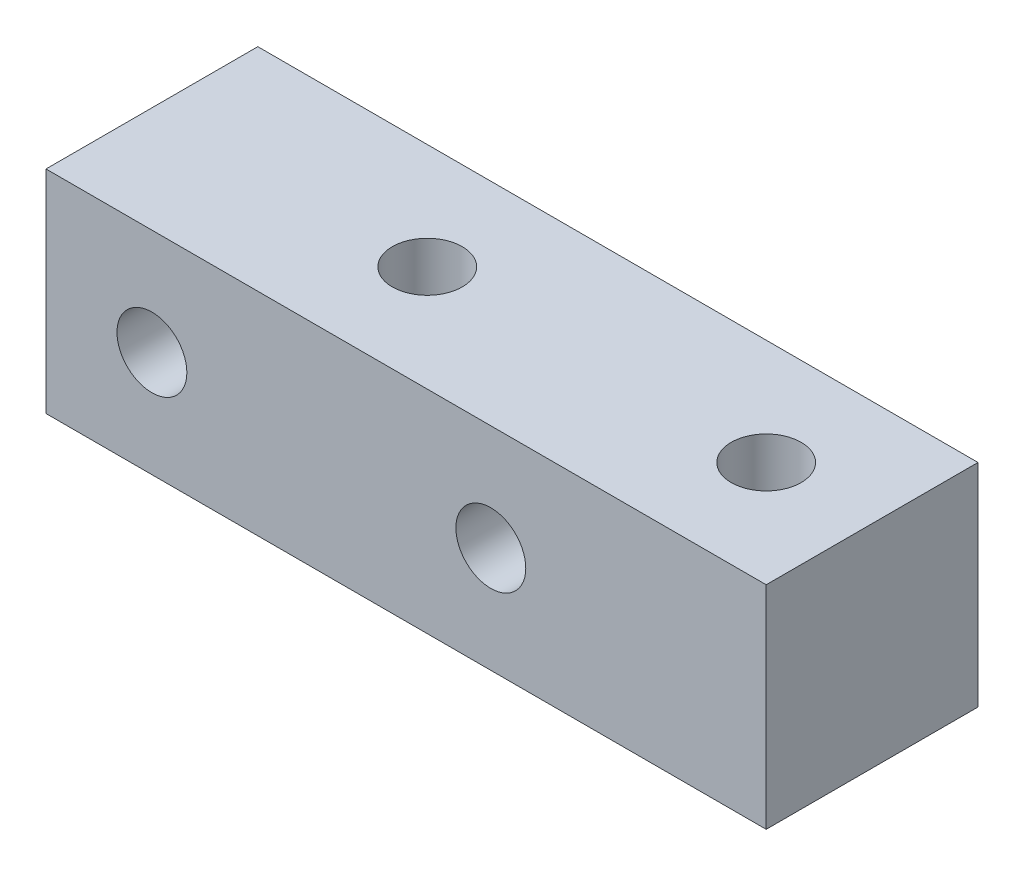
ISO-10303-21;
HEADER;
FILE_DESCRIPTION(('STEP AP214'),'2;1');
FILE_NAME('part.step','',(''),(''),'','','');
FILE_SCHEMA(('AUTOMOTIVE_DESIGN { 1 0 10303 214 1 1 1 1 }'));
ENDSEC;
DATA;
#1=APPLICATION_CONTEXT('core data for automotive mechanical design processes');
#2=APPLICATION_PROTOCOL_DEFINITION('international standard','automotive_design',2000,#1);
#3=PRODUCT_CONTEXT('',#1,'mechanical');
#4=PRODUCT('Part','Part','',(#3));
#5=PRODUCT_RELATED_PRODUCT_CATEGORY('part','',(#4));
#6=PRODUCT_DEFINITION_FORMATION('','',#4);
#7=PRODUCT_DEFINITION_CONTEXT('part definition',#1,'design');
#8=PRODUCT_DEFINITION('design','',#6,#7);
#9=PRODUCT_DEFINITION_SHAPE('','',#8);
#10=(LENGTH_UNIT() NAMED_UNIT(*) SI_UNIT(.MILLI.,.METRE.));
#11=(NAMED_UNIT(*) PLANE_ANGLE_UNIT() SI_UNIT($,.RADIAN.));
#12=(NAMED_UNIT(*) SI_UNIT($,.STERADIAN.) SOLID_ANGLE_UNIT());
#13=UNCERTAINTY_MEASURE_WITH_UNIT(LENGTH_MEASURE(1.E-05),#10,'distance_accuracy_value','');
#14=(GEOMETRIC_REPRESENTATION_CONTEXT(3) GLOBAL_UNCERTAINTY_ASSIGNED_CONTEXT((#13)) GLOBAL_UNIT_ASSIGNED_CONTEXT((#10,
#11,#12)) REPRESENTATION_CONTEXT('',''));
#15=CARTESIAN_POINT('',(0.,0.,0.));
#16=DIRECTION('',(0.,0.,1.));
#17=DIRECTION('',(1.,0.,0.));
#18=AXIS2_PLACEMENT_3D('',#15,#16,#17);
#19=CARTESIAN_POINT('',(-17.,-5.,10.));
#20=DIRECTION('',(1.,0.,0.));
#21=DIRECTION('',(0.,0.,-1.));
#22=AXIS2_PLACEMENT_3D('',#19,#20,#21);
#23=PLANE('',#22);
#24=DIRECTION('',(0.,-1.,0.));
#25=VECTOR('',#24,1.);
#26=CARTESIAN_POINT('',(-17.,-5.,0.));
#27=LINE('',#26,#25);
#28=CARTESIAN_POINT('',(-17.,5.,0.));
#29=VERTEX_POINT('',#28);
#30=CARTESIAN_POINT('',(-17.,-5.,0.));
#31=VERTEX_POINT('',#30);
#32=EDGE_CURVE('E107',#29,#31,#27,.T.);
#33=ORIENTED_EDGE('',*,*,#32,.T.);
#34=DIRECTION('',(0.,0.,-1.));
#35=VECTOR('',#34,1.);
#36=CARTESIAN_POINT('',(-17.,-5.,10.));
#37=LINE('',#36,#35);
#38=CARTESIAN_POINT('',(-17.,-5.,10.));
#39=VERTEX_POINT('',#38);
#40=EDGE_CURVE('E11',#39,#31,#37,.T.);
#41=ORIENTED_EDGE('',*,*,#40,.F.);
#42=DIRECTION('',(0.,-1.,0.));
#43=VECTOR('',#42,1.);
#44=CARTESIAN_POINT('',(-17.,-5.,10.));
#45=LINE('',#44,#43);
#46=CARTESIAN_POINT('',(-17.,5.,10.));
#47=VERTEX_POINT('',#46);
#48=EDGE_CURVE('E91',#47,#39,#45,.T.);
#49=ORIENTED_EDGE('',*,*,#48,.F.);
#50=DIRECTION('',(0.,0.,-1.));
#51=VECTOR('',#50,1.);
#52=CARTESIAN_POINT('',(-17.,5.,10.));
#53=LINE('',#52,#51);
#54=EDGE_CURVE('E103',#47,#29,#53,.T.);
#55=ORIENTED_EDGE('',*,*,#54,.T.);
#56=EDGE_LOOP('',(#33,#41,#49,#55));
#57=FACE_BOUND('',#56,.T.);
#58=ADVANCED_FACE('F39',(#57),#23,.F.);
#59=CARTESIAN_POINT('',(17.,-5.,10.));
#60=DIRECTION('',(0.,1.,0.));
#61=DIRECTION('',(-1.,0.,0.));
#62=AXIS2_PLACEMENT_3D('',#59,#60,#61);
#63=PLANE('',#62);
#64=CARTESIAN_POINT('',(-4.,-5.00000000000001,5.));
#65=DIRECTION('',(0.,1.,0.));
#66=DIRECTION('',(0.,0.,1.));
#67=AXIS2_PLACEMENT_3D('',#64,#65,#66);
#68=CIRCLE('',#67,1.65);
#69=CARTESIAN_POINT('',(-4.,-5.00000000000001,6.65));
#70=VERTEX_POINT('',#69);
#71=EDGE_CURVE('E151',#70,#70,#68,.T.);
#72=ORIENTED_EDGE('',*,*,#71,.T.);
#73=EDGE_LOOP('',(#72));
#74=FACE_BOUND('',#73,.T.);
#75=CARTESIAN_POINT('',(12.,-5.00000000000001,5.));
#76=DIRECTION('',(0.,1.,0.));
#77=DIRECTION('',(0.,0.,1.));
#78=AXIS2_PLACEMENT_3D('',#75,#76,#77);
#79=CIRCLE('',#78,1.65);
#80=CARTESIAN_POINT('',(12.,-5.00000000000001,6.65));
#81=VERTEX_POINT('',#80);
#82=EDGE_CURVE('E143',#81,#81,#79,.T.);
#83=ORIENTED_EDGE('',*,*,#82,.T.);
#84=EDGE_LOOP('',(#83));
#85=FACE_BOUND('',#84,.T.);
#86=DIRECTION('',(1.,0.,0.));
#87=VECTOR('',#86,1.);
#88=CARTESIAN_POINT('',(17.,-5.,0.));
#89=LINE('',#88,#87);
#90=CARTESIAN_POINT('',(17.,-5.,0.));
#91=VERTEX_POINT('',#90);
#92=EDGE_CURVE('E96',#31,#91,#89,.T.);
#93=ORIENTED_EDGE('',*,*,#92,.T.);
#94=DIRECTION('',(0.,0.,-1.));
#95=VECTOR('',#94,1.);
#96=CARTESIAN_POINT('',(17.,-5.,10.));
#97=LINE('',#96,#95);
#98=CARTESIAN_POINT('',(17.,-5.,10.));
#99=VERTEX_POINT('',#98);
#100=EDGE_CURVE('E48',#99,#91,#97,.T.);
#101=ORIENTED_EDGE('',*,*,#100,.F.);
#102=DIRECTION('',(1.,0.,0.));
#103=VECTOR('',#102,1.);
#104=CARTESIAN_POINT('',(17.,-5.,10.));
#105=LINE('',#104,#103);
#106=EDGE_CURVE('E86',#39,#99,#105,.T.);
#107=ORIENTED_EDGE('',*,*,#106,.F.);
#108=ORIENTED_EDGE('',*,*,#40,.T.);
#109=EDGE_LOOP('',(#93,#101,#107,#108));
#110=FACE_BOUND('',#109,.T.);
#111=ADVANCED_FACE('F95',(#74,#85,#110),#63,.F.);
#112=CARTESIAN_POINT('',(17.,-5.,10.));
#113=DIRECTION('',(-1.,0.,0.));
#114=DIRECTION('',(0.,0.,1.));
#115=AXIS2_PLACEMENT_3D('',#112,#113,#114);
#116=PLANE('',#115);
#117=DIRECTION('',(0.,1.,0.));
#118=VECTOR('',#117,1.);
#119=CARTESIAN_POINT('',(17.,-5.,0.));
#120=LINE('',#119,#118);
#121=CARTESIAN_POINT('',(17.,5.,0.));
#122=VERTEX_POINT('',#121);
#123=EDGE_CURVE('E73',#91,#122,#120,.T.);
#124=ORIENTED_EDGE('',*,*,#123,.T.);
#125=DIRECTION('',(0.,0.,-1.));
#126=VECTOR('',#125,1.);
#127=CARTESIAN_POINT('',(17.,5.,10.));
#128=LINE('',#127,#126);
#129=CARTESIAN_POINT('',(17.,5.,10.));
#130=VERTEX_POINT('',#129);
#131=EDGE_CURVE('E98',#130,#122,#128,.T.);
#132=ORIENTED_EDGE('',*,*,#131,.F.);
#133=DIRECTION('',(0.,1.,0.));
#134=VECTOR('',#133,1.);
#135=CARTESIAN_POINT('',(17.,-5.,10.));
#136=LINE('',#135,#134);
#137=EDGE_CURVE('E89',#99,#130,#136,.T.);
#138=ORIENTED_EDGE('',*,*,#137,.F.);
#139=ORIENTED_EDGE('',*,*,#100,.T.);
#140=EDGE_LOOP('',(#124,#132,#138,#139));
#141=FACE_BOUND('',#140,.T.);
#142=ADVANCED_FACE('F99',(#141),#116,.F.);
#143=CARTESIAN_POINT('',(17.,5.,10.));
#144=DIRECTION('',(0.,-1.,0.));
#145=DIRECTION('',(1.,0.,0.));
#146=AXIS2_PLACEMENT_3D('',#143,#144,#145);
#147=PLANE('',#146);
#148=CARTESIAN_POINT('',(-4.,5.,5.));
#149=DIRECTION('',(0.,1.,0.));
#150=DIRECTION('',(0.,0.,1.));
#151=AXIS2_PLACEMENT_3D('',#148,#149,#150);
#152=CIRCLE('',#151,1.65);
#153=CARTESIAN_POINT('',(-4.,5.,6.65));
#154=VERTEX_POINT('',#153);
#155=EDGE_CURVE('E155',#154,#154,#152,.T.);
#156=ORIENTED_EDGE('',*,*,#155,.F.);
#157=EDGE_LOOP('',(#156));
#158=FACE_BOUND('',#157,.T.);
#159=CARTESIAN_POINT('',(12.,5.,5.));
#160=DIRECTION('',(0.,1.,0.));
#161=DIRECTION('',(0.,0.,1.));
#162=AXIS2_PLACEMENT_3D('',#159,#160,#161);
#163=CIRCLE('',#162,1.65);
#164=CARTESIAN_POINT('',(12.,5.,6.65));
#165=VERTEX_POINT('',#164);
#166=EDGE_CURVE('E147',#165,#165,#163,.T.);
#167=ORIENTED_EDGE('',*,*,#166,.F.);
#168=EDGE_LOOP('',(#167));
#169=FACE_BOUND('',#168,.T.);
#170=DIRECTION('',(-1.,0.,0.));
#171=VECTOR('',#170,1.);
#172=CARTESIAN_POINT('',(17.,5.,0.));
#173=LINE('',#172,#171);
#174=EDGE_CURVE('E79',#122,#29,#173,.T.);
#175=ORIENTED_EDGE('',*,*,#174,.T.);
#176=ORIENTED_EDGE('',*,*,#54,.F.);
#177=DIRECTION('',(-1.,0.,0.));
#178=VECTOR('',#177,1.);
#179=CARTESIAN_POINT('',(17.,5.,10.));
#180=LINE('',#179,#178);
#181=EDGE_CURVE('E56',#130,#47,#180,.T.);
#182=ORIENTED_EDGE('',*,*,#181,.F.);
#183=ORIENTED_EDGE('',*,*,#131,.T.);
#184=EDGE_LOOP('',(#175,#176,#182,#183));
#185=FACE_BOUND('',#184,.T.);
#186=ADVANCED_FACE('F121',(#158,#169,#185),#147,.F.);
#187=CARTESIAN_POINT('',(0.,0.,10.));
#188=DIRECTION('',(0.,0.,1.));
#189=DIRECTION('',(1.,0.,0.));
#190=AXIS2_PLACEMENT_3D('',#187,#188,#189);
#191=PLANE('',#190);
#192=CARTESIAN_POINT('',(4.,0.,10.));
#193=DIRECTION('',(0.,0.,1.));
#194=DIRECTION('',(1.,0.,0.));
#195=AXIS2_PLACEMENT_3D('',#192,#193,#194);
#196=CIRCLE('',#195,1.65);
#197=CARTESIAN_POINT('',(5.65,0.,10.));
#198=VERTEX_POINT('',#197);
#199=EDGE_CURVE('E139',#198,#198,#196,.T.);
#200=ORIENTED_EDGE('',*,*,#199,.F.);
#201=EDGE_LOOP('',(#200));
#202=FACE_BOUND('',#201,.T.);
#203=CARTESIAN_POINT('',(-12.,0.,10.));
#204=DIRECTION('',(0.,0.,1.));
#205=DIRECTION('',(1.,0.,0.));
#206=AXIS2_PLACEMENT_3D('',#203,#204,#205);
#207=CIRCLE('',#206,1.65);
#208=CARTESIAN_POINT('',(-10.35,0.,10.));
#209=VERTEX_POINT('',#208);
#210=EDGE_CURVE('E131',#209,#209,#207,.T.);
#211=ORIENTED_EDGE('',*,*,#210,.F.);
#212=EDGE_LOOP('',(#211));
#213=FACE_BOUND('',#212,.T.);
#214=ORIENTED_EDGE('',*,*,#48,.T.);
#215=ORIENTED_EDGE('',*,*,#106,.T.);
#216=ORIENTED_EDGE('',*,*,#137,.T.);
#217=ORIENTED_EDGE('',*,*,#181,.T.);
#218=EDGE_LOOP('',(#214,#215,#216,#217));
#219=FACE_BOUND('',#218,.T.);
#220=ADVANCED_FACE('F87',(#202,#213,#219),#191,.T.);
#221=CARTESIAN_POINT('',(0.,0.,0.));
#222=DIRECTION('',(0.,0.,1.));
#223=DIRECTION('',(1.,0.,0.));
#224=AXIS2_PLACEMENT_3D('',#221,#222,#223);
#225=PLANE('',#224);
#226=CARTESIAN_POINT('',(4.,0.,0.));
#227=DIRECTION('',(0.,0.,1.));
#228=DIRECTION('',(1.,0.,0.));
#229=AXIS2_PLACEMENT_3D('',#226,#227,#228);
#230=CIRCLE('',#229,1.65);
#231=CARTESIAN_POINT('',(5.65,0.,0.));
#232=VERTEX_POINT('',#231);
#233=EDGE_CURVE('E135',#232,#232,#230,.T.);
#234=ORIENTED_EDGE('',*,*,#233,.T.);
#235=EDGE_LOOP('',(#234));
#236=FACE_BOUND('',#235,.T.);
#237=CARTESIAN_POINT('',(-12.,0.,0.));
#238=DIRECTION('',(0.,0.,1.));
#239=DIRECTION('',(1.,0.,0.));
#240=AXIS2_PLACEMENT_3D('',#237,#238,#239);
#241=CIRCLE('',#240,1.65);
#242=CARTESIAN_POINT('',(-10.35,0.,0.));
#243=VERTEX_POINT('',#242);
#244=EDGE_CURVE('E111',#243,#243,#241,.T.);
#245=ORIENTED_EDGE('',*,*,#244,.T.);
#246=EDGE_LOOP('',(#245));
#247=FACE_BOUND('',#246,.T.);
#248=ORIENTED_EDGE('',*,*,#32,.F.);
#249=ORIENTED_EDGE('',*,*,#174,.F.);
#250=ORIENTED_EDGE('',*,*,#123,.F.);
#251=ORIENTED_EDGE('',*,*,#92,.F.);
#252=EDGE_LOOP('',(#248,#249,#250,#251));
#253=FACE_BOUND('',#252,.T.);
#254=ADVANCED_FACE('F124',(#236,#247,#253),#225,.F.);
#255=CARTESIAN_POINT('',(-12.,0.,10.));
#256=DIRECTION('',(0.,0.,1.));
#257=DIRECTION('',(1.,0.,0.));
#258=AXIS2_PLACEMENT_3D('',#255,#256,#257);
#259=CYLINDRICAL_SURFACE('',#258,1.65);
#260=ORIENTED_EDGE('',*,*,#244,.F.);
#261=EDGE_LOOP('',(#260));
#262=FACE_BOUND('',#261,.T.);
#263=ORIENTED_EDGE('',*,*,#210,.T.);
#264=EDGE_LOOP('',(#263));
#265=FACE_BOUND('',#264,.T.);
#266=ADVANCED_FACE('F178',(#262,#265),#259,.F.);
#267=CARTESIAN_POINT('',(4.,0.,10.));
#268=DIRECTION('',(0.,0.,1.));
#269=DIRECTION('',(1.,0.,0.));
#270=AXIS2_PLACEMENT_3D('',#267,#268,#269);
#271=CYLINDRICAL_SURFACE('',#270,1.65);
#272=ORIENTED_EDGE('',*,*,#233,.F.);
#273=EDGE_LOOP('',(#272));
#274=FACE_BOUND('',#273,.T.);
#275=ORIENTED_EDGE('',*,*,#199,.T.);
#276=EDGE_LOOP('',(#275));
#277=FACE_BOUND('',#276,.T.);
#278=ADVANCED_FACE('F169',(#274,#277),#271,.F.);
#279=CARTESIAN_POINT('',(12.,5.,5.));
#280=DIRECTION('',(0.,1.,0.));
#281=DIRECTION('',(0.,0.,1.));
#282=AXIS2_PLACEMENT_3D('',#279,#280,#281);
#283=CYLINDRICAL_SURFACE('',#282,1.65);
#284=ORIENTED_EDGE('',*,*,#82,.F.);
#285=EDGE_LOOP('',(#284));
#286=FACE_BOUND('',#285,.T.);
#287=ORIENTED_EDGE('',*,*,#166,.T.);
#288=EDGE_LOOP('',(#287));
#289=FACE_BOUND('',#288,.T.);
#290=ADVANCED_FACE('F167',(#286,#289),#283,.F.);
#291=CARTESIAN_POINT('',(-4.,5.,5.));
#292=DIRECTION('',(0.,1.,0.));
#293=DIRECTION('',(0.,0.,1.));
#294=AXIS2_PLACEMENT_3D('',#291,#292,#293);
#295=CYLINDRICAL_SURFACE('',#294,1.65);
#296=ORIENTED_EDGE('',*,*,#71,.F.);
#297=EDGE_LOOP('',(#296));
#298=FACE_BOUND('',#297,.T.);
#299=ORIENTED_EDGE('',*,*,#155,.T.);
#300=EDGE_LOOP('',(#299));
#301=FACE_BOUND('',#300,.T.);
#302=ADVANCED_FACE('F160',(#298,#301),#295,.F.);
#303=CLOSED_SHELL('',(#58,#111,#142,#186,#220,#254,#266,#278,#290,#302));
#304=MANIFOLD_SOLID_BREP('B2',#303);
#305=ADVANCED_BREP_SHAPE_REPRESENTATION('',(#18,#304),#14);
#306=SHAPE_DEFINITION_REPRESENTATION(#9,#305);
ENDSEC;
END-ISO-10303-21;
